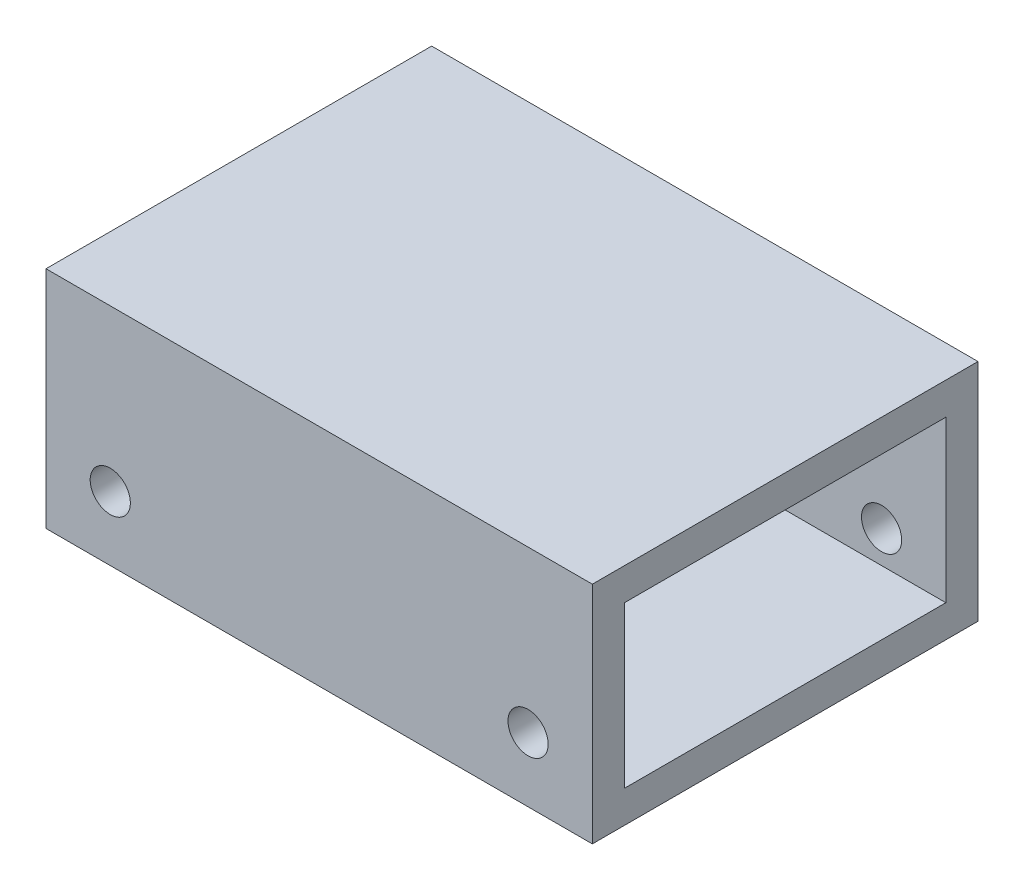
ISO-10303-21;
HEADER;
FILE_DESCRIPTION(('STEP AP214'),'2;1');
FILE_NAME('part.step','',(''),(''),'','','');
FILE_SCHEMA(('AUTOMOTIVE_DESIGN { 1 0 10303 214 1 1 1 1 }'));
ENDSEC;
DATA;
#1=APPLICATION_CONTEXT('core data for automotive mechanical design processes');
#2=APPLICATION_PROTOCOL_DEFINITION('international standard','automotive_design',2000,#1);
#3=PRODUCT_CONTEXT('',#1,'mechanical');
#4=PRODUCT('Part','Part','',(#3));
#5=PRODUCT_RELATED_PRODUCT_CATEGORY('part','',(#4));
#6=PRODUCT_DEFINITION_FORMATION('','',#4);
#7=PRODUCT_DEFINITION_CONTEXT('part definition',#1,'design');
#8=PRODUCT_DEFINITION('design','',#6,#7);
#9=PRODUCT_DEFINITION_SHAPE('','',#8);
#10=(LENGTH_UNIT() NAMED_UNIT(*) SI_UNIT(.MILLI.,.METRE.));
#11=(NAMED_UNIT(*) PLANE_ANGLE_UNIT() SI_UNIT($,.RADIAN.));
#12=(NAMED_UNIT(*) SI_UNIT($,.STERADIAN.) SOLID_ANGLE_UNIT());
#13=UNCERTAINTY_MEASURE_WITH_UNIT(LENGTH_MEASURE(1.E-05),#10,'distance_accuracy_value','');
#14=(GEOMETRIC_REPRESENTATION_CONTEXT(3) GLOBAL_UNCERTAINTY_ASSIGNED_CONTEXT((#13)) GLOBAL_UNIT_ASSIGNED_CONTEXT((#10,
#11,#12)) REPRESENTATION_CONTEXT('',''));
#15=CARTESIAN_POINT('',(0.,0.,0.));
#16=DIRECTION('',(0.,0.,1.));
#17=DIRECTION('',(1.,0.,0.));
#18=AXIS2_PLACEMENT_3D('',#15,#16,#17);
#19=CARTESIAN_POINT('',(-25.4,25.4,0.));
#20=DIRECTION('',(0.,0.,1.));
#21=DIRECTION('',(1.,0.,0.));
#22=AXIS2_PLACEMENT_3D('',#19,#20,#21);
#23=CYLINDRICAL_SURFACE('',#22,7.93749999999998);
#24=CARTESIAN_POINT('',(-25.4,25.4,-152.4));
#25=DIRECTION('',(0.,0.,1.));
#26=DIRECTION('',(1.,0.,0.));
#27=AXIS2_PLACEMENT_3D('',#24,#25,#26);
#28=CIRCLE('',#27,7.93749999999997);
#29=CARTESIAN_POINT('',(-17.4625,25.4,-152.4));
#30=VERTEX_POINT('',#29);
#31=EDGE_CURVE('E176',#30,#30,#28,.T.);
#32=ORIENTED_EDGE('',*,*,#31,.F.);
#33=EDGE_LOOP('',(#32));
#34=FACE_BOUND('',#33,.T.);
#35=CARTESIAN_POINT('',(-25.4,25.4,-139.7));
#36=DIRECTION('',(0.,0.,1.));
#37=DIRECTION('',(1.,0.,0.));
#38=AXIS2_PLACEMENT_3D('',#35,#36,#37);
#39=CIRCLE('',#38,7.93749999999998);
#40=CARTESIAN_POINT('',(-17.4625,25.4,-139.7));
#41=VERTEX_POINT('',#40);
#42=EDGE_CURVE('E156',#41,#41,#39,.F.);
#43=ORIENTED_EDGE('',*,*,#42,.F.);
#44=EDGE_LOOP('',(#43));
#45=FACE_BOUND('',#44,.T.);
#46=ADVANCED_FACE('F41',(#34,#45),#23,.F.);
#47=CARTESIAN_POINT('',(-190.5,25.4,0.));
#48=DIRECTION('',(0.,0.,1.));
#49=DIRECTION('',(1.,0.,0.));
#50=AXIS2_PLACEMENT_3D('',#47,#48,#49);
#51=CYLINDRICAL_SURFACE('',#50,7.93749999999997);
#52=CARTESIAN_POINT('',(-190.5,25.4,-152.4));
#53=DIRECTION('',(0.,0.,1.));
#54=DIRECTION('',(1.,0.,0.));
#55=AXIS2_PLACEMENT_3D('',#52,#53,#54);
#56=CIRCLE('',#55,7.93749999999996);
#57=CARTESIAN_POINT('',(-182.5625,25.4,-152.4));
#58=VERTEX_POINT('',#57);
#59=EDGE_CURVE('E168',#58,#58,#56,.T.);
#60=ORIENTED_EDGE('',*,*,#59,.F.);
#61=EDGE_LOOP('',(#60));
#62=FACE_BOUND('',#61,.T.);
#63=CARTESIAN_POINT('',(-190.5,25.4,-139.7));
#64=DIRECTION('',(0.,0.,1.));
#65=DIRECTION('',(1.,0.,0.));
#66=AXIS2_PLACEMENT_3D('',#63,#64,#65);
#67=CIRCLE('',#66,7.93749999999997);
#68=CARTESIAN_POINT('',(-182.5625,25.4,-139.7));
#69=VERTEX_POINT('',#68);
#70=EDGE_CURVE('E150',#69,#69,#67,.F.);
#71=ORIENTED_EDGE('',*,*,#70,.F.);
#72=EDGE_LOOP('',(#71));
#73=FACE_BOUND('',#72,.T.);
#74=ADVANCED_FACE('F222',(#62,#73),#51,.F.);
#75=CARTESIAN_POINT('',(-215.9,88.9,0.));
#76=DIRECTION('',(-1.,0.,0.));
#77=DIRECTION('',(0.,0.,1.));
#78=AXIS2_PLACEMENT_3D('',#75,#76,#77);
#79=PLANE('',#78);
#80=DIRECTION('',(0.,0.,-1.));
#81=VECTOR('',#80,1.);
#82=CARTESIAN_POINT('',(-215.9,12.7,-12.7));
#83=LINE('',#82,#81);
#84=CARTESIAN_POINT('',(-215.9,12.7,-12.7));
#85=VERTEX_POINT('',#84);
#86=CARTESIAN_POINT('',(-215.9,12.7,-139.7));
#87=VERTEX_POINT('',#86);
#88=EDGE_CURVE('E117',#85,#87,#83,.T.);
#89=ORIENTED_EDGE('',*,*,#88,.T.);
#90=DIRECTION('',(0.,-1.,0.));
#91=VECTOR('',#90,1.);
#92=CARTESIAN_POINT('',(-215.9,76.2,-139.7));
#93=LINE('',#92,#91);
#94=CARTESIAN_POINT('',(-215.9,76.2,-139.7));
#95=VERTEX_POINT('',#94);
#96=EDGE_CURVE('E107',#95,#87,#93,.T.);
#97=ORIENTED_EDGE('',*,*,#96,.F.);
#98=DIRECTION('',(0.,0.,-1.));
#99=VECTOR('',#98,1.);
#100=CARTESIAN_POINT('',(-215.9,76.2,-12.7));
#101=LINE('',#100,#99);
#102=CARTESIAN_POINT('',(-215.9,76.2,-12.7));
#103=VERTEX_POINT('',#102);
#104=EDGE_CURVE('E116',#103,#95,#101,.T.);
#105=ORIENTED_EDGE('',*,*,#104,.F.);
#106=DIRECTION('',(0.,-1.,0.));
#107=VECTOR('',#106,1.);
#108=CARTESIAN_POINT('',(-215.9,76.2,-12.7));
#109=LINE('',#108,#107);
#110=EDGE_CURVE('E123',#103,#85,#109,.T.);
#111=ORIENTED_EDGE('',*,*,#110,.T.);
#112=EDGE_LOOP('',(#89,#97,#105,#111));
#113=FACE_BOUND('',#112,.T.);
#114=DIRECTION('',(0.,0.,-1.));
#115=VECTOR('',#114,1.);
#116=CARTESIAN_POINT('',(-215.9,0.,0.));
#117=LINE('',#116,#115);
#118=CARTESIAN_POINT('',(-215.9,0.,0.));
#119=VERTEX_POINT('',#118);
#120=CARTESIAN_POINT('',(-215.9,0.,-152.4));
#121=VERTEX_POINT('',#120);
#122=EDGE_CURVE('E180',#119,#121,#117,.T.);
#123=ORIENTED_EDGE('',*,*,#122,.F.);
#124=DIRECTION('',(0.,-1.,0.));
#125=VECTOR('',#124,1.);
#126=CARTESIAN_POINT('',(-215.9,88.9,0.));
#127=LINE('',#126,#125);
#128=CARTESIAN_POINT('',(-215.9,88.9,0.));
#129=VERTEX_POINT('',#128);
#130=EDGE_CURVE('E11',#129,#119,#127,.T.);
#131=ORIENTED_EDGE('',*,*,#130,.F.);
#132=DIRECTION('',(0.,0.,-1.));
#133=VECTOR('',#132,1.);
#134=CARTESIAN_POINT('',(-215.9,88.9,0.));
#135=LINE('',#134,#133);
#136=CARTESIAN_POINT('',(-215.9,88.9,-152.4));
#137=VERTEX_POINT('',#136);
#138=EDGE_CURVE('E181',#129,#137,#135,.T.);
#139=ORIENTED_EDGE('',*,*,#138,.T.);
#140=DIRECTION('',(0.,-1.,0.));
#141=VECTOR('',#140,1.);
#142=CARTESIAN_POINT('',(-215.9,88.9,-152.4));
#143=LINE('',#142,#141);
#144=EDGE_CURVE('E196',#137,#121,#143,.T.);
#145=ORIENTED_EDGE('',*,*,#144,.T.);
#146=EDGE_LOOP('',(#123,#131,#139,#145));
#147=FACE_BOUND('',#146,.T.);
#148=ADVANCED_FACE('F43',(#113,#147),#79,.T.);
#149=CARTESIAN_POINT('',(0.,88.9,0.));
#150=DIRECTION('',(0.,0.,1.));
#151=DIRECTION('',(1.,0.,0.));
#152=AXIS2_PLACEMENT_3D('',#149,#150,#151);
#153=PLANE('',#152);
#154=CARTESIAN_POINT('',(-190.5,25.4,0.));
#155=DIRECTION('',(0.,0.,1.));
#156=DIRECTION('',(1.,0.,0.));
#157=AXIS2_PLACEMENT_3D('',#154,#155,#156);
#158=CIRCLE('',#157,7.93749999999999);
#159=CARTESIAN_POINT('',(-182.5625,25.4,0.));
#160=VERTEX_POINT('',#159);
#161=EDGE_CURVE('E164',#160,#160,#158,.T.);
#162=ORIENTED_EDGE('',*,*,#161,.F.);
#163=EDGE_LOOP('',(#162));
#164=FACE_BOUND('',#163,.T.);
#165=CARTESIAN_POINT('',(-25.4,25.4,0.));
#166=DIRECTION('',(0.,0.,1.));
#167=DIRECTION('',(1.,0.,0.));
#168=AXIS2_PLACEMENT_3D('',#165,#166,#167);
#169=CIRCLE('',#168,7.93749999999999);
#170=CARTESIAN_POINT('',(-17.4625,25.4,0.));
#171=VERTEX_POINT('',#170);
#172=EDGE_CURVE('E172',#171,#171,#169,.T.);
#173=ORIENTED_EDGE('',*,*,#172,.F.);
#174=EDGE_LOOP('',(#173));
#175=FACE_BOUND('',#174,.T.);
#176=DIRECTION('',(-1.,0.,0.));
#177=VECTOR('',#176,1.);
#178=CARTESIAN_POINT('',(0.,0.,0.));
#179=LINE('',#178,#177);
#180=CARTESIAN_POINT('',(0.,0.,0.));
#181=VERTEX_POINT('',#180);
#182=EDGE_CURVE('E200',#181,#119,#179,.T.);
#183=ORIENTED_EDGE('',*,*,#182,.F.);
#184=DIRECTION('',(0.,-1.,0.));
#185=VECTOR('',#184,1.);
#186=CARTESIAN_POINT('',(0.,88.9,0.));
#187=LINE('',#186,#185);
#188=CARTESIAN_POINT('',(0.,88.9,0.));
#189=VERTEX_POINT('',#188);
#190=EDGE_CURVE('E51',#189,#181,#187,.T.);
#191=ORIENTED_EDGE('',*,*,#190,.F.);
#192=DIRECTION('',(-1.,0.,0.));
#193=VECTOR('',#192,1.);
#194=CARTESIAN_POINT('',(0.,88.9,0.));
#195=LINE('',#194,#193);
#196=EDGE_CURVE('E185',#189,#129,#195,.T.);
#197=ORIENTED_EDGE('',*,*,#196,.T.);
#198=ORIENTED_EDGE('',*,*,#130,.T.);
#199=EDGE_LOOP('',(#183,#191,#197,#198));
#200=FACE_BOUND('',#199,.T.);
#201=ADVANCED_FACE('F231',(#164,#175,#200),#153,.T.);
#202=CARTESIAN_POINT('',(0.,88.9,0.));
#203=DIRECTION('',(-1.,0.,0.));
#204=DIRECTION('',(0.,0.,1.));
#205=AXIS2_PLACEMENT_3D('',#202,#203,#204);
#206=PLANE('',#205);
#207=DIRECTION('',(0.,-1.,0.));
#208=VECTOR('',#207,1.);
#209=CARTESIAN_POINT('',(0.,76.2,-139.7));
#210=LINE('',#209,#208);
#211=CARTESIAN_POINT('',(0.,76.2,-139.7));
#212=VERTEX_POINT('',#211);
#213=CARTESIAN_POINT('',(0.,12.7,-139.7));
#214=VERTEX_POINT('',#213);
#215=EDGE_CURVE('E141',#212,#214,#210,.T.);
#216=ORIENTED_EDGE('',*,*,#215,.T.);
#217=DIRECTION('',(0.,0.,-1.));
#218=VECTOR('',#217,1.);
#219=CARTESIAN_POINT('',(0.,12.7,-12.7));
#220=LINE('',#219,#218);
#221=CARTESIAN_POINT('',(0.,12.7,-12.7));
#222=VERTEX_POINT('',#221);
#223=EDGE_CURVE('E67',#222,#214,#220,.T.);
#224=ORIENTED_EDGE('',*,*,#223,.F.);
#225=DIRECTION('',(0.,-1.,0.));
#226=VECTOR('',#225,1.);
#227=CARTESIAN_POINT('',(0.,76.2,-12.7));
#228=LINE('',#227,#226);
#229=CARTESIAN_POINT('',(0.,76.2,-12.7));
#230=VERTEX_POINT('',#229);
#231=EDGE_CURVE('E128',#230,#222,#228,.T.);
#232=ORIENTED_EDGE('',*,*,#231,.F.);
#233=DIRECTION('',(0.,0.,-1.));
#234=VECTOR('',#233,1.);
#235=CARTESIAN_POINT('',(0.,76.2,-12.7));
#236=LINE('',#235,#234);
#237=EDGE_CURVE('E132',#230,#212,#236,.T.);
#238=ORIENTED_EDGE('',*,*,#237,.T.);
#239=EDGE_LOOP('',(#216,#224,#232,#238));
#240=FACE_BOUND('',#239,.T.);
#241=DIRECTION('',(0.,0.,-1.));
#242=VECTOR('',#241,1.);
#243=CARTESIAN_POINT('',(0.,0.,0.));
#244=LINE('',#243,#242);
#245=CARTESIAN_POINT('',(0.,0.,-152.4));
#246=VERTEX_POINT('',#245);
#247=EDGE_CURVE('E204',#181,#246,#244,.T.);
#248=ORIENTED_EDGE('',*,*,#247,.T.);
#249=DIRECTION('',(0.,-1.,0.));
#250=VECTOR('',#249,1.);
#251=CARTESIAN_POINT('',(0.,88.9,-152.4));
#252=LINE('',#251,#250);
#253=CARTESIAN_POINT('',(0.,88.9,-152.4));
#254=VERTEX_POINT('',#253);
#255=EDGE_CURVE('E212',#254,#246,#252,.T.);
#256=ORIENTED_EDGE('',*,*,#255,.F.);
#257=DIRECTION('',(0.,0.,-1.));
#258=VECTOR('',#257,1.);
#259=CARTESIAN_POINT('',(0.,88.9,0.));
#260=LINE('',#259,#258);
#261=EDGE_CURVE('E190',#189,#254,#260,.T.);
#262=ORIENTED_EDGE('',*,*,#261,.F.);
#263=ORIENTED_EDGE('',*,*,#190,.T.);
#264=EDGE_LOOP('',(#248,#256,#262,#263));
#265=FACE_BOUND('',#264,.T.);
#266=ADVANCED_FACE('F255',(#240,#265),#206,.F.);
#267=CARTESIAN_POINT('',(0.,88.9,-152.4));
#268=DIRECTION('',(0.,0.,1.));
#269=DIRECTION('',(1.,0.,0.));
#270=AXIS2_PLACEMENT_3D('',#267,#268,#269);
#271=PLANE('',#270);
#272=ORIENTED_EDGE('',*,*,#59,.T.);
#273=EDGE_LOOP('',(#272));
#274=FACE_BOUND('',#273,.T.);
#275=ORIENTED_EDGE('',*,*,#31,.T.);
#276=EDGE_LOOP('',(#275));
#277=FACE_BOUND('',#276,.T.);
#278=DIRECTION('',(-1.,0.,0.));
#279=VECTOR('',#278,1.);
#280=CARTESIAN_POINT('',(0.,0.,-152.4));
#281=LINE('',#280,#279);
#282=EDGE_CURVE('E186',#246,#121,#281,.T.);
#283=ORIENTED_EDGE('',*,*,#282,.T.);
#284=ORIENTED_EDGE('',*,*,#144,.F.);
#285=DIRECTION('',(-1.,0.,0.));
#286=VECTOR('',#285,1.);
#287=CARTESIAN_POINT('',(0.,88.9,-152.4));
#288=LINE('',#287,#286);
#289=EDGE_CURVE('E193',#254,#137,#288,.T.);
#290=ORIENTED_EDGE('',*,*,#289,.F.);
#291=ORIENTED_EDGE('',*,*,#255,.T.);
#292=EDGE_LOOP('',(#283,#284,#290,#291));
#293=FACE_BOUND('',#292,.T.);
#294=ADVANCED_FACE('F268',(#274,#277,#293),#271,.F.);
#295=CARTESIAN_POINT('',(0.,88.9,0.));
#296=DIRECTION('',(0.,1.,0.));
#297=DIRECTION('',(0.,0.,1.));
#298=AXIS2_PLACEMENT_3D('',#295,#296,#297);
#299=PLANE('',#298);
#300=ORIENTED_EDGE('',*,*,#138,.F.);
#301=ORIENTED_EDGE('',*,*,#196,.F.);
#302=ORIENTED_EDGE('',*,*,#261,.T.);
#303=ORIENTED_EDGE('',*,*,#289,.T.);
#304=EDGE_LOOP('',(#300,#301,#302,#303));
#305=FACE_BOUND('',#304,.T.);
#306=ADVANCED_FACE('F272',(#305),#299,.T.);
#307=CARTESIAN_POINT('',(0.,0.,0.));
#308=DIRECTION('',(0.,1.,0.));
#309=DIRECTION('',(0.,0.,1.));
#310=AXIS2_PLACEMENT_3D('',#307,#308,#309);
#311=PLANE('',#310);
#312=ORIENTED_EDGE('',*,*,#122,.T.);
#313=ORIENTED_EDGE('',*,*,#282,.F.);
#314=ORIENTED_EDGE('',*,*,#247,.F.);
#315=ORIENTED_EDGE('',*,*,#182,.T.);
#316=EDGE_LOOP('',(#312,#313,#314,#315));
#317=FACE_BOUND('',#316,.T.);
#318=ADVANCED_FACE('F246',(#317),#311,.F.);
#319=CARTESIAN_POINT('',(-25.4,25.4,-12.7));
#320=DIRECTION('',(0.,0.,1.));
#321=DIRECTION('',(0.,-1.,0.));
#322=AXIS2_PLACEMENT_3D('',#319,#320,#321);
#323=CIRCLE('',#322,7.93749999999998);
#324=CARTESIAN_POINT('',(-25.4,17.4625,-12.7));
#325=VERTEX_POINT('',#324);
#326=EDGE_CURVE('E160',#325,#325,#323,.F.);
#327=ORIENTED_EDGE('',*,*,#326,.T.);
#328=EDGE_LOOP('',(#327));
#329=FACE_BOUND('',#328,.T.);
#330=ORIENTED_EDGE('',*,*,#172,.T.);
#331=EDGE_LOOP('',(#330));
#332=FACE_BOUND('',#331,.T.);
#333=ADVANCED_FACE('F234',(#329,#332),#23,.F.);
#334=CARTESIAN_POINT('',(-190.5,25.4,-12.7));
#335=DIRECTION('',(0.,0.,1.));
#336=DIRECTION('',(0.,-1.,0.));
#337=AXIS2_PLACEMENT_3D('',#334,#335,#336);
#338=CIRCLE('',#337,7.93749999999997);
#339=CARTESIAN_POINT('',(-190.5,17.4625,-12.7));
#340=VERTEX_POINT('',#339);
#341=EDGE_CURVE('E45',#340,#340,#338,.F.);
#342=ORIENTED_EDGE('',*,*,#341,.T.);
#343=EDGE_LOOP('',(#342));
#344=FACE_BOUND('',#343,.T.);
#345=ORIENTED_EDGE('',*,*,#161,.T.);
#346=EDGE_LOOP('',(#345));
#347=FACE_BOUND('',#346,.T.);
#348=ADVANCED_FACE('F226',(#344,#347),#51,.F.);
#349=CARTESIAN_POINT('',(-215.9,76.2,-12.7));
#350=DIRECTION('',(0.,0.,1.));
#351=DIRECTION('',(0.,-1.,0.));
#352=AXIS2_PLACEMENT_3D('',#349,#350,#351);
#353=PLANE('',#352);
#354=ORIENTED_EDGE('',*,*,#341,.F.);
#355=EDGE_LOOP('',(#354));
#356=FACE_BOUND('',#355,.T.);
#357=ORIENTED_EDGE('',*,*,#231,.T.);
#358=DIRECTION('',(1.,0.,0.));
#359=VECTOR('',#358,1.);
#360=CARTESIAN_POINT('',(-215.9,12.7,-12.7));
#361=LINE('',#360,#359);
#362=EDGE_CURVE('E147',#85,#222,#361,.T.);
#363=ORIENTED_EDGE('',*,*,#362,.F.);
#364=ORIENTED_EDGE('',*,*,#110,.F.);
#365=DIRECTION('',(1.,0.,0.));
#366=VECTOR('',#365,1.);
#367=CARTESIAN_POINT('',(-215.9,76.2,-12.7));
#368=LINE('',#367,#366);
#369=EDGE_CURVE('E151',#103,#230,#368,.T.);
#370=ORIENTED_EDGE('',*,*,#369,.T.);
#371=EDGE_LOOP('',(#357,#363,#364,#370));
#372=FACE_BOUND('',#371,.T.);
#373=ORIENTED_EDGE('',*,*,#326,.F.);
#374=EDGE_LOOP('',(#373));
#375=FACE_BOUND('',#374,.T.);
#376=ADVANCED_FACE('F238',(#356,#372,#375),#353,.F.);
#377=CARTESIAN_POINT('',(-215.9,76.2,-139.7));
#378=DIRECTION('',(0.,0.,1.));
#379=DIRECTION('',(1.,0.,0.));
#380=AXIS2_PLACEMENT_3D('',#377,#378,#379);
#381=PLANE('',#380);
#382=ORIENTED_EDGE('',*,*,#215,.F.);
#383=DIRECTION('',(1.,0.,0.));
#384=VECTOR('',#383,1.);
#385=CARTESIAN_POINT('',(-215.9,76.2,-139.7));
#386=LINE('',#385,#384);
#387=EDGE_CURVE('E59',#95,#212,#386,.T.);
#388=ORIENTED_EDGE('',*,*,#387,.F.);
#389=ORIENTED_EDGE('',*,*,#96,.T.);
#390=DIRECTION('',(1.,0.,0.));
#391=VECTOR('',#390,1.);
#392=CARTESIAN_POINT('',(-215.9,12.7,-139.7));
#393=LINE('',#392,#391);
#394=EDGE_CURVE('E110',#87,#214,#393,.T.);
#395=ORIENTED_EDGE('',*,*,#394,.T.);
#396=EDGE_LOOP('',(#382,#388,#389,#395));
#397=FACE_BOUND('',#396,.T.);
#398=ORIENTED_EDGE('',*,*,#70,.T.);
#399=EDGE_LOOP('',(#398));
#400=FACE_BOUND('',#399,.T.);
#401=ORIENTED_EDGE('',*,*,#42,.T.);
#402=EDGE_LOOP('',(#401));
#403=FACE_BOUND('',#402,.T.);
#404=ADVANCED_FACE('F108',(#397,#400,#403),#381,.T.);
#405=CARTESIAN_POINT('',(-215.9,12.7,-12.7));
#406=DIRECTION('',(0.,-1.,0.));
#407=DIRECTION('',(0.,0.,-1.));
#408=AXIS2_PLACEMENT_3D('',#405,#406,#407);
#409=PLANE('',#408);
#410=ORIENTED_EDGE('',*,*,#223,.T.);
#411=ORIENTED_EDGE('',*,*,#394,.F.);
#412=ORIENTED_EDGE('',*,*,#88,.F.);
#413=ORIENTED_EDGE('',*,*,#362,.T.);
#414=EDGE_LOOP('',(#410,#411,#412,#413));
#415=FACE_BOUND('',#414,.T.);
#416=ADVANCED_FACE('F120',(#415),#409,.F.);
#417=CARTESIAN_POINT('',(-215.9,76.2,-12.7));
#418=DIRECTION('',(0.,-1.,0.));
#419=DIRECTION('',(0.,0.,-1.));
#420=AXIS2_PLACEMENT_3D('',#417,#418,#419);
#421=PLANE('',#420);
#422=ORIENTED_EDGE('',*,*,#237,.F.);
#423=ORIENTED_EDGE('',*,*,#369,.F.);
#424=ORIENTED_EDGE('',*,*,#104,.T.);
#425=ORIENTED_EDGE('',*,*,#387,.T.);
#426=EDGE_LOOP('',(#422,#423,#424,#425));
#427=FACE_BOUND('',#426,.T.);
#428=ADVANCED_FACE('F291',(#427),#421,.T.);
#429=CLOSED_SHELL('',(#46,#74,#148,#201,#266,#294,#306,#318,#333,#348,#376,#404,#416,#428));
#430=MANIFOLD_SOLID_BREP('B2',#429);
#431=ADVANCED_BREP_SHAPE_REPRESENTATION('',(#18,#430),#14);
#432=SHAPE_DEFINITION_REPRESENTATION(#9,#431);
ENDSEC;
END-ISO-10303-21;
